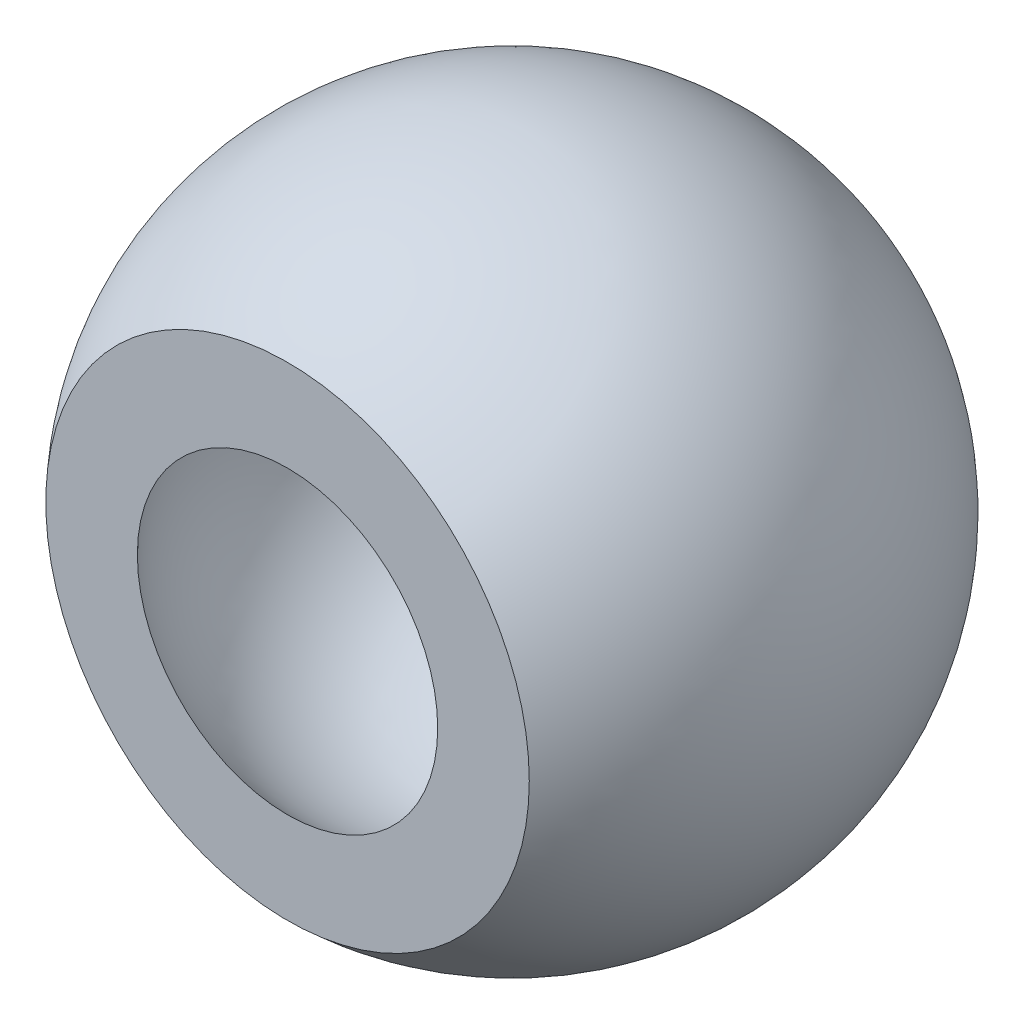
ISO-10303-21;
HEADER;
FILE_DESCRIPTION(('STEP AP214'),'2;1');
FILE_NAME('part.step','',(''),(''),'','','');
FILE_SCHEMA(('AUTOMOTIVE_DESIGN { 1 0 10303 214 1 1 1 1 }'));
ENDSEC;
DATA;
#1=APPLICATION_CONTEXT('core data for automotive mechanical design processes');
#2=APPLICATION_PROTOCOL_DEFINITION('international standard','automotive_design',2000,#1);
#3=PRODUCT_CONTEXT('',#1,'mechanical');
#4=PRODUCT('Part','Part','',(#3));
#5=PRODUCT_RELATED_PRODUCT_CATEGORY('part','',(#4));
#6=PRODUCT_DEFINITION_FORMATION('','',#4);
#7=PRODUCT_DEFINITION_CONTEXT('part definition',#1,'design');
#8=PRODUCT_DEFINITION('design','',#6,#7);
#9=PRODUCT_DEFINITION_SHAPE('','',#8);
#10=(LENGTH_UNIT() NAMED_UNIT(*) SI_UNIT(.MILLI.,.METRE.));
#11=(NAMED_UNIT(*) PLANE_ANGLE_UNIT() SI_UNIT($,.RADIAN.));
#12=(NAMED_UNIT(*) SI_UNIT($,.STERADIAN.) SOLID_ANGLE_UNIT());
#13=UNCERTAINTY_MEASURE_WITH_UNIT(LENGTH_MEASURE(1.E-05),#10,'distance_accuracy_value','');
#14=(GEOMETRIC_REPRESENTATION_CONTEXT(3) GLOBAL_UNCERTAINTY_ASSIGNED_CONTEXT((#13)) GLOBAL_UNIT_ASSIGNED_CONTEXT((#10,
#11,#12)) REPRESENTATION_CONTEXT('',''));
#15=CARTESIAN_POINT('',(0.,0.,0.));
#16=DIRECTION('',(0.,0.,1.));
#17=DIRECTION('',(1.,0.,0.));
#18=AXIS2_PLACEMENT_3D('',#15,#16,#17);
#19=CARTESIAN_POINT('',(0.,-25.,5.17896436009276));
#20=DIRECTION('',(0.,0.,-1.));
#21=DIRECTION('',(-1.,0.,0.));
#22=AXIS2_PLACEMENT_3D('',#19,#20,#21);
#23=SPHERICAL_SURFACE('',#22,16.4137503728601);
#24=CARTESIAN_POINT('',(0.,-25.,17.));
#25=DIRECTION('',(0.,0.,1.));
#26=DIRECTION('',(1.,0.,0.));
#27=AXIS2_PLACEMENT_3D('',#24,#25,#26);
#28=CIRCLE('',#27,11.3874631811746);
#29=CARTESIAN_POINT('',(11.3874631811746,-25.,17.));
#30=VERTEX_POINT('',#29);
#31=EDGE_CURVE('E39',#30,#30,#28,.F.);
#32=ORIENTED_EDGE('',*,*,#31,.F.);
#33=EDGE_LOOP('',(#32));
#34=FACE_BOUND('',#33,.T.);
#35=ADVANCED_FACE('F35',(#34),#23,.F.);
#36=CARTESIAN_POINT('',(0.,0.,17.));
#37=DIRECTION('',(0.,0.,1.));
#38=DIRECTION('',(1.,0.,0.));
#39=AXIS2_PLACEMENT_3D('',#36,#37,#38);
#40=PLANE('',#39);
#41=ORIENTED_EDGE('',*,*,#31,.T.);
#42=EDGE_LOOP('',(#41));
#43=FACE_BOUND('',#42,.T.);
#44=CARTESIAN_POINT('',(0.,-25.,17.));
#45=DIRECTION('',(0.,0.,1.));
#46=DIRECTION('',(1.,0.,0.));
#47=AXIS2_PLACEMENT_3D('',#44,#45,#46);
#48=CIRCLE('',#47,18.3303027798234);
#49=CARTESIAN_POINT('',(18.3303027798234,-25.,17.));
#50=VERTEX_POINT('',#49);
#51=EDGE_CURVE('E10',#50,#50,#48,.T.);
#52=ORIENTED_EDGE('',*,*,#51,.T.);
#53=EDGE_LOOP('',(#52));
#54=FACE_BOUND('',#53,.T.);
#55=ADVANCED_FACE('F48',(#43,#54),#40,.T.);
#56=CARTESIAN_POINT('',(0.,-25.,0.));
#57=DIRECTION('',(0.,1.,0.));
#58=DIRECTION('',(1.,0.,0.));
#59=AXIS2_PLACEMENT_3D('',#56,#57,#58);
#60=SPHERICAL_SURFACE('',#59,25.);
#61=CARTESIAN_POINT('',(0.,-25.,0.));
#62=DIRECTION('',(0.,0.,1.));
#63=DIRECTION('',(1.,0.,0.));
#64=AXIS2_PLACEMENT_3D('',#61,#62,#63);
#65=SPHERICAL_SURFACE('',#64,25.);
#66=ORIENTED_EDGE('',*,*,#51,.F.);
#67=EDGE_LOOP('',(#66));
#68=FACE_BOUND('',#67,.T.);
#69=ADVANCED_FACE('F37',(#68),#65,.T.);
#70=CLOSED_SHELL('',(#35,#55,#69));
#71=MANIFOLD_SOLID_BREP('B2',#70);
#72=ADVANCED_BREP_SHAPE_REPRESENTATION('',(#18,#71),#14);
#73=SHAPE_DEFINITION_REPRESENTATION(#9,#72);
ENDSEC;
END-ISO-10303-21;
